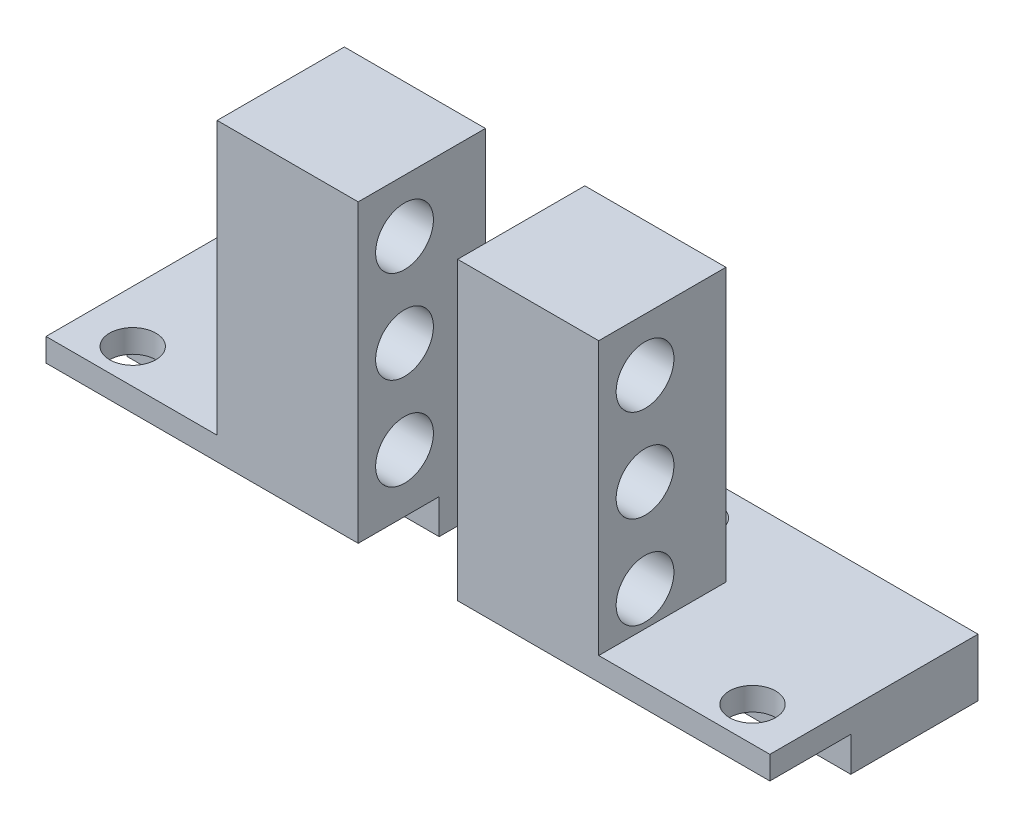
ISO-10303-21;
HEADER;
FILE_DESCRIPTION(('STEP AP214'),'2;1');
FILE_NAME('part.step','',(''),(''),'','','');
FILE_SCHEMA(('AUTOMOTIVE_DESIGN { 1 0 10303 214 1 1 1 1 }'));
ENDSEC;
DATA;
#1=APPLICATION_CONTEXT('core data for automotive mechanical design processes');
#2=APPLICATION_PROTOCOL_DEFINITION('international standard','automotive_design',2000,#1);
#3=PRODUCT_CONTEXT('',#1,'mechanical');
#4=PRODUCT('Part','Part','',(#3));
#5=PRODUCT_RELATED_PRODUCT_CATEGORY('part','',(#4));
#6=PRODUCT_DEFINITION_FORMATION('','',#4);
#7=PRODUCT_DEFINITION_CONTEXT('part definition',#1,'design');
#8=PRODUCT_DEFINITION('design','',#6,#7);
#9=PRODUCT_DEFINITION_SHAPE('','',#8);
#10=(LENGTH_UNIT() NAMED_UNIT(*) SI_UNIT(.MILLI.,.METRE.));
#11=(NAMED_UNIT(*) PLANE_ANGLE_UNIT() SI_UNIT($,.RADIAN.));
#12=(NAMED_UNIT(*) SI_UNIT($,.STERADIAN.) SOLID_ANGLE_UNIT());
#13=UNCERTAINTY_MEASURE_WITH_UNIT(LENGTH_MEASURE(1.E-05),#10,'distance_accuracy_value','');
#14=(GEOMETRIC_REPRESENTATION_CONTEXT(3) GLOBAL_UNCERTAINTY_ASSIGNED_CONTEXT((#13)) GLOBAL_UNIT_ASSIGNED_CONTEXT((#10,
#11,#12)) REPRESENTATION_CONTEXT('',''));
#15=CARTESIAN_POINT('',(0.,0.,0.));
#16=DIRECTION('',(0.,0.,1.));
#17=DIRECTION('',(1.,0.,0.));
#18=AXIS2_PLACEMENT_3D('',#15,#16,#17);
#19=CARTESIAN_POINT('',(0.,-23.578,-18.));
#20=DIRECTION('',(-1.,0.,0.));
#21=DIRECTION('',(0.,0.,1.));
#22=AXIS2_PLACEMENT_3D('',#19,#20,#21);
#23=PLANE('',#22);
#24=DIRECTION('',(0.,1.,0.));
#25=VECTOR('',#24,1.);
#26=CARTESIAN_POINT('',(0.,-23.578,-11.));
#27=LINE('',#26,#25);
#28=CARTESIAN_POINT('',(0.,-23.578,-11.));
#29=VERTEX_POINT('',#28);
#30=CARTESIAN_POINT('',(0.,0.,-11.));
#31=VERTEX_POINT('',#30);
#32=EDGE_CURVE('E186',#29,#31,#27,.T.);
#33=ORIENTED_EDGE('',*,*,#32,.F.);
#34=DIRECTION('',(0.,0.,1.));
#35=VECTOR('',#34,1.);
#36=CARTESIAN_POINT('',(0.,-23.578,-18.));
#37=LINE('',#36,#35);
#38=CARTESIAN_POINT('',(0.,-23.578,0.));
#39=VERTEX_POINT('',#38);
#40=EDGE_CURVE('E104',#29,#39,#37,.T.);
#41=ORIENTED_EDGE('',*,*,#40,.T.);
#42=DIRECTION('',(0.,-1.,0.));
#43=VECTOR('',#42,1.);
#44=CARTESIAN_POINT('',(0.,-23.578,0.));
#45=LINE('',#44,#43);
#46=CARTESIAN_POINT('',(0.,0.,0.));
#47=VERTEX_POINT('',#46);
#48=EDGE_CURVE('E101',#47,#39,#45,.T.);
#49=ORIENTED_EDGE('',*,*,#48,.F.);
#50=DIRECTION('',(0.,0.,1.));
#51=VECTOR('',#50,1.);
#52=CARTESIAN_POINT('',(0.,0.,-18.));
#53=LINE('',#52,#51);
#54=EDGE_CURVE('E11',#31,#47,#53,.T.);
#55=ORIENTED_EDGE('',*,*,#54,.F.);
#56=EDGE_LOOP('',(#33,#41,#49,#55));
#57=FACE_BOUND('',#56,.T.);
#58=CARTESIAN_POINT('',(0.,-4.57800000000001,-4.00493473861688));
#59=DIRECTION('',(-1.,0.,0.));
#60=DIRECTION('',(0.,0.,1.));
#61=AXIS2_PLACEMENT_3D('',#58,#59,#60);
#62=CIRCLE('',#61,2.5);
#63=CARTESIAN_POINT('',(0.,-4.57800000000001,-1.50493473861688));
#64=VERTEX_POINT('',#63);
#65=EDGE_CURVE('E110',#64,#64,#62,.T.);
#66=ORIENTED_EDGE('',*,*,#65,.F.);
#67=EDGE_LOOP('',(#66));
#68=FACE_BOUND('',#67,.T.);
#69=CARTESIAN_POINT('',(0.,-12.578,-4.00493473861688));
#70=DIRECTION('',(-1.,0.,0.));
#71=DIRECTION('',(0.,0.,1.));
#72=AXIS2_PLACEMENT_3D('',#69,#70,#71);
#73=CIRCLE('',#72,2.5);
#74=CARTESIAN_POINT('',(0.,-12.578,-1.50493473861688));
#75=VERTEX_POINT('',#74);
#76=EDGE_CURVE('E194',#75,#75,#73,.T.);
#77=ORIENTED_EDGE('',*,*,#76,.F.);
#78=EDGE_LOOP('',(#77));
#79=FACE_BOUND('',#78,.T.);
#80=CARTESIAN_POINT('',(0.,-20.578,-4.00493473861688));
#81=DIRECTION('',(-1.,0.,0.));
#82=DIRECTION('',(0.,0.,1.));
#83=AXIS2_PLACEMENT_3D('',#80,#81,#82);
#84=CIRCLE('',#83,2.5);
#85=CARTESIAN_POINT('',(0.,-20.578,-1.50493473861688));
#86=VERTEX_POINT('',#85);
#87=EDGE_CURVE('E190',#86,#86,#84,.T.);
#88=ORIENTED_EDGE('',*,*,#87,.F.);
#89=EDGE_LOOP('',(#88));
#90=FACE_BOUND('',#89,.T.);
#91=ADVANCED_FACE('F45',(#57,#68,#79,#90),#23,.T.);
#92=CARTESIAN_POINT('',(0.,0.,-18.));
#93=DIRECTION('',(0.,1.,0.));
#94=DIRECTION('',(0.,0.,1.));
#95=AXIS2_PLACEMENT_3D('',#92,#93,#94);
#96=PLANE('',#95);
#97=DIRECTION('',(-1.,0.,0.));
#98=VECTOR('',#97,1.);
#99=CARTESIAN_POINT('',(12.2,0.,-11.));
#100=LINE('',#99,#98);
#101=CARTESIAN_POINT('',(12.2,0.,-11.));
#102=VERTEX_POINT('',#101);
#103=EDGE_CURVE('E97',#102,#31,#100,.T.);
#104=ORIENTED_EDGE('',*,*,#103,.T.);
#105=ORIENTED_EDGE('',*,*,#54,.T.);
#106=DIRECTION('',(-1.,0.,0.));
#107=VECTOR('',#106,1.);
#108=CARTESIAN_POINT('',(0.,0.,0.));
#109=LINE('',#108,#107);
#110=CARTESIAN_POINT('',(12.2,0.,0.));
#111=VERTEX_POINT('',#110);
#112=EDGE_CURVE('E95',#111,#47,#109,.T.);
#113=ORIENTED_EDGE('',*,*,#112,.F.);
#114=DIRECTION('',(0.,0.,1.));
#115=VECTOR('',#114,1.);
#116=CARTESIAN_POINT('',(12.2,0.,-18.));
#117=LINE('',#116,#115);
#118=EDGE_CURVE('E54',#102,#111,#117,.T.);
#119=ORIENTED_EDGE('',*,*,#118,.F.);
#120=EDGE_LOOP('',(#104,#105,#113,#119));
#121=FACE_BOUND('',#120,.T.);
#122=ADVANCED_FACE('F92',(#121),#96,.T.);
#123=CARTESIAN_POINT('',(12.2,0.,-18.));
#124=DIRECTION('',(1.,0.,0.));
#125=DIRECTION('',(0.,1.,0.));
#126=AXIS2_PLACEMENT_3D('',#123,#124,#125);
#127=PLANE('',#126);
#128=DIRECTION('',(0.,-1.,0.));
#129=VECTOR('',#128,1.);
#130=CARTESIAN_POINT('',(12.2,-23.578,-11.));
#131=LINE('',#130,#129);
#132=CARTESIAN_POINT('',(12.2,-23.578,-11.));
#133=VERTEX_POINT('',#132);
#134=CARTESIAN_POINT('',(12.2,-28.578,-11.));
#135=VERTEX_POINT('',#134);
#136=EDGE_CURVE('E396',#133,#135,#131,.T.);
#137=ORIENTED_EDGE('',*,*,#136,.F.);
#138=DIRECTION('',(0.,1.,0.));
#139=VECTOR('',#138,1.);
#140=CARTESIAN_POINT('',(12.2,-23.578,-11.));
#141=LINE('',#140,#139);
#142=EDGE_CURVE('E182',#133,#102,#141,.T.);
#143=ORIENTED_EDGE('',*,*,#142,.T.);
#144=ORIENTED_EDGE('',*,*,#118,.T.);
#145=DIRECTION('',(0.,1.,0.));
#146=VECTOR('',#145,1.);
#147=CARTESIAN_POINT('',(12.2,0.,0.));
#148=LINE('',#147,#146);
#149=CARTESIAN_POINT('',(12.2,-25.578,0.));
#150=VERTEX_POINT('',#149);
#151=EDGE_CURVE('E116',#150,#111,#148,.T.);
#152=ORIENTED_EDGE('',*,*,#151,.F.);
#153=DIRECTION('',(0.,0.,-1.));
#154=VECTOR('',#153,1.);
#155=CARTESIAN_POINT('',(12.2,-25.578,0.));
#156=LINE('',#155,#154);
#157=CARTESIAN_POINT('',(12.2,-25.578,-7.));
#158=VERTEX_POINT('',#157);
#159=EDGE_CURVE('E62',#150,#158,#156,.T.);
#160=ORIENTED_EDGE('',*,*,#159,.T.);
#161=DIRECTION('',(0.,-1.,0.));
#162=VECTOR('',#161,1.);
#163=CARTESIAN_POINT('',(12.2,-28.578,-7.));
#164=LINE('',#163,#162);
#165=CARTESIAN_POINT('',(12.2,-28.578,-7.));
#166=VERTEX_POINT('',#165);
#167=EDGE_CURVE('E426',#158,#166,#164,.T.);
#168=ORIENTED_EDGE('',*,*,#167,.T.);
#169=DIRECTION('',(0.,0.,1.));
#170=VECTOR('',#169,1.);
#171=CARTESIAN_POINT('',(12.2,-28.578,-18.));
#172=LINE('',#171,#170);
#173=EDGE_CURVE('E131',#135,#166,#172,.T.);
#174=ORIENTED_EDGE('',*,*,#173,.F.);
#175=EDGE_LOOP('',(#137,#143,#144,#152,#160,#168,#174));
#176=FACE_BOUND('',#175,.T.);
#177=CARTESIAN_POINT('',(12.2,-4.57800000000001,-4.00493473861688));
#178=DIRECTION('',(-1.,0.,0.));
#179=DIRECTION('',(0.,0.,1.));
#180=AXIS2_PLACEMENT_3D('',#177,#178,#179);
#181=CIRCLE('',#180,2.5);
#182=CARTESIAN_POINT('',(12.2,-4.57800000000001,-1.50493473861688));
#183=VERTEX_POINT('',#182);
#184=EDGE_CURVE('E168',#183,#183,#181,.T.);
#185=ORIENTED_EDGE('',*,*,#184,.T.);
#186=EDGE_LOOP('',(#185));
#187=FACE_BOUND('',#186,.T.);
#188=CARTESIAN_POINT('',(12.2,-12.578,-4.00493473861688));
#189=DIRECTION('',(-1.,0.,0.));
#190=DIRECTION('',(0.,0.,1.));
#191=AXIS2_PLACEMENT_3D('',#188,#189,#190);
#192=CIRCLE('',#191,2.5);
#193=CARTESIAN_POINT('',(12.2,-12.578,-1.50493473861688));
#194=VERTEX_POINT('',#193);
#195=EDGE_CURVE('E173',#194,#194,#192,.T.);
#196=ORIENTED_EDGE('',*,*,#195,.T.);
#197=EDGE_LOOP('',(#196));
#198=FACE_BOUND('',#197,.T.);
#199=CARTESIAN_POINT('',(12.2,-20.578,-4.00493473861688));
#200=DIRECTION('',(-1.,0.,0.));
#201=DIRECTION('',(0.,0.,1.));
#202=AXIS2_PLACEMENT_3D('',#199,#200,#201);
#203=CIRCLE('',#202,2.5);
#204=CARTESIAN_POINT('',(12.2,-20.578,-1.50493473861688));
#205=VERTEX_POINT('',#204);
#206=EDGE_CURVE('E178',#205,#205,#203,.T.);
#207=ORIENTED_EDGE('',*,*,#206,.T.);
#208=EDGE_LOOP('',(#207));
#209=FACE_BOUND('',#208,.T.);
#210=ADVANCED_FACE('F218',(#176,#187,#198,#209),#127,.T.);
#211=CARTESIAN_POINT('',(12.2,-28.578,-18.));
#212=DIRECTION('',(0.,-1.,0.));
#213=DIRECTION('',(1.,0.,0.));
#214=AXIS2_PLACEMENT_3D('',#211,#212,#213);
#215=PLANE('',#214);
#216=CARTESIAN_POINT('',(6.1,-28.578,-14.5));
#217=DIRECTION('',(0.,1.,0.));
#218=DIRECTION('',(0.,0.,1.));
#219=AXIS2_PLACEMENT_3D('',#216,#217,#218);
#220=CIRCLE('',#219,2.);
#221=CARTESIAN_POINT('',(6.1,-28.578,-12.5));
#222=VERTEX_POINT('',#221);
#223=EDGE_CURVE('E400',#222,#222,#220,.T.);
#224=ORIENTED_EDGE('',*,*,#223,.T.);
#225=EDGE_LOOP('',(#224));
#226=FACE_BOUND('',#225,.T.);
#227=DIRECTION('',(-1.,0.,0.));
#228=VECTOR('',#227,1.);
#229=CARTESIAN_POINT('',(12.2,-28.578,-7.));
#230=LINE('',#229,#228);
#231=CARTESIAN_POINT('',(-14.8,-28.578,-7.));
#232=VERTEX_POINT('',#231);
#233=EDGE_CURVE('E431',#166,#232,#230,.T.);
#234=ORIENTED_EDGE('',*,*,#233,.T.);
#235=DIRECTION('',(0.,0.,1.));
#236=VECTOR('',#235,1.);
#237=CARTESIAN_POINT('',(-14.8,-28.578,-18.));
#238=LINE('',#237,#236);
#239=CARTESIAN_POINT('',(-14.8,-28.578,-18.));
#240=VERTEX_POINT('',#239);
#241=EDGE_CURVE('E71',#240,#232,#238,.T.);
#242=ORIENTED_EDGE('',*,*,#241,.F.);
#243=DIRECTION('',(1.,0.,0.));
#244=VECTOR('',#243,1.);
#245=CARTESIAN_POINT('',(12.2,-28.578,-18.));
#246=LINE('',#245,#244);
#247=CARTESIAN_POINT('',(47.8,-28.578,-18.));
#248=VERTEX_POINT('',#247);
#249=EDGE_CURVE('E140',#240,#248,#246,.T.);
#250=ORIENTED_EDGE('',*,*,#249,.T.);
#251=DIRECTION('',(0.,0.,1.));
#252=VECTOR('',#251,1.);
#253=CARTESIAN_POINT('',(47.8,-28.578,-18.));
#254=LINE('',#253,#252);
#255=CARTESIAN_POINT('',(47.8,-28.578,-7.));
#256=VERTEX_POINT('',#255);
#257=EDGE_CURVE('E379',#248,#256,#254,.T.);
#258=ORIENTED_EDGE('',*,*,#257,.T.);
#259=DIRECTION('',(1.,0.,0.));
#260=VECTOR('',#259,1.);
#261=CARTESIAN_POINT('',(20.8,-28.578,-7.));
#262=LINE('',#261,#260);
#263=CARTESIAN_POINT('',(20.8,-28.578,-7.));
#264=VERTEX_POINT('',#263);
#265=EDGE_CURVE('E303',#264,#256,#262,.T.);
#266=ORIENTED_EDGE('',*,*,#265,.F.);
#267=DIRECTION('',(0.,0.,1.));
#268=VECTOR('',#267,1.);
#269=CARTESIAN_POINT('',(20.8,-28.578,-18.));
#270=LINE('',#269,#268);
#271=CARTESIAN_POINT('',(20.8,-28.578,-11.));
#272=VERTEX_POINT('',#271);
#273=EDGE_CURVE('E375',#272,#264,#270,.T.);
#274=ORIENTED_EDGE('',*,*,#273,.F.);
#275=DIRECTION('',(-1.,0.,0.));
#276=VECTOR('',#275,1.);
#277=CARTESIAN_POINT('',(47.802,-28.578,-11.));
#278=LINE('',#277,#276);
#279=EDGE_CURVE('E395',#272,#135,#278,.T.);
#280=ORIENTED_EDGE('',*,*,#279,.T.);
#281=ORIENTED_EDGE('',*,*,#173,.T.);
#282=EDGE_LOOP('',(#234,#242,#250,#258,#266,#274,#280,#281));
#283=FACE_BOUND('',#282,.T.);
#284=CARTESIAN_POINT('',(26.9,-28.578,-14.5));
#285=DIRECTION('',(0.,-1.,0.));
#286=DIRECTION('',(0.,0.,1.));
#287=AXIS2_PLACEMENT_3D('',#284,#285,#286);
#288=CIRCLE('',#287,2.);
#289=CARTESIAN_POINT('',(26.9,-28.578,-12.5));
#290=VERTEX_POINT('',#289);
#291=EDGE_CURVE('E265',#290,#290,#288,.T.);
#292=ORIENTED_EDGE('',*,*,#291,.F.);
#293=EDGE_LOOP('',(#292));
#294=FACE_BOUND('',#293,.T.);
#295=ADVANCED_FACE('F220',(#226,#283,#294),#215,.T.);
#296=CARTESIAN_POINT('',(-14.8,-28.578,-18.));
#297=DIRECTION('',(-1.,0.,0.));
#298=DIRECTION('',(0.,0.,1.));
#299=AXIS2_PLACEMENT_3D('',#296,#297,#298);
#300=PLANE('',#299);
#301=DIRECTION('',(0.,-1.,0.));
#302=VECTOR('',#301,1.);
#303=CARTESIAN_POINT('',(-14.8,-28.578,-7.));
#304=LINE('',#303,#302);
#305=CARTESIAN_POINT('',(-14.8,-25.578,-7.));
#306=VERTEX_POINT('',#305);
#307=EDGE_CURVE('E166',#306,#232,#304,.T.);
#308=ORIENTED_EDGE('',*,*,#307,.F.);
#309=DIRECTION('',(0.,0.,-1.));
#310=VECTOR('',#309,1.);
#311=CARTESIAN_POINT('',(-14.8,-25.578,0.));
#312=LINE('',#311,#310);
#313=CARTESIAN_POINT('',(-14.8,-25.578,0.));
#314=VERTEX_POINT('',#313);
#315=EDGE_CURVE('E164',#314,#306,#312,.T.);
#316=ORIENTED_EDGE('',*,*,#315,.F.);
#317=DIRECTION('',(0.,-1.,0.));
#318=VECTOR('',#317,1.);
#319=CARTESIAN_POINT('',(-14.8,-28.578,0.));
#320=LINE('',#319,#318);
#321=CARTESIAN_POINT('',(-14.8,-23.578,0.));
#322=VERTEX_POINT('',#321);
#323=EDGE_CURVE('E125',#322,#314,#320,.T.);
#324=ORIENTED_EDGE('',*,*,#323,.F.);
#325=DIRECTION('',(0.,0.,1.));
#326=VECTOR('',#325,1.);
#327=CARTESIAN_POINT('',(-14.8,-23.578,-18.));
#328=LINE('',#327,#326);
#329=CARTESIAN_POINT('',(-14.8,-23.578,-18.));
#330=VERTEX_POINT('',#329);
#331=EDGE_CURVE('E137',#330,#322,#328,.T.);
#332=ORIENTED_EDGE('',*,*,#331,.F.);
#333=DIRECTION('',(0.,-1.,0.));
#334=VECTOR('',#333,1.);
#335=CARTESIAN_POINT('',(-14.8,-28.578,-18.));
#336=LINE('',#335,#334);
#337=EDGE_CURVE('E123',#330,#240,#336,.T.);
#338=ORIENTED_EDGE('',*,*,#337,.T.);
#339=ORIENTED_EDGE('',*,*,#241,.T.);
#340=EDGE_LOOP('',(#308,#316,#324,#332,#338,#339));
#341=FACE_BOUND('',#340,.T.);
#342=ADVANCED_FACE('F161',(#341),#300,.T.);
#343=CARTESIAN_POINT('',(-14.8,-23.578,-18.));
#344=DIRECTION('',(0.,1.,0.));
#345=DIRECTION('',(0.,0.,1.));
#346=AXIS2_PLACEMENT_3D('',#343,#344,#345);
#347=PLANE('',#346);
#348=CARTESIAN_POINT('',(-10.3,-23.578,-3.));
#349=DIRECTION('',(0.,1.,0.));
#350=DIRECTION('',(0.,0.,1.));
#351=AXIS2_PLACEMENT_3D('',#348,#349,#350);
#352=CIRCLE('',#351,2.);
#353=CARTESIAN_POINT('',(-10.3,-23.578,-1.));
#354=VERTEX_POINT('',#353);
#355=EDGE_CURVE('E248',#354,#354,#352,.T.);
#356=ORIENTED_EDGE('',*,*,#355,.F.);
#357=EDGE_LOOP('',(#356));
#358=FACE_BOUND('',#357,.T.);
#359=CARTESIAN_POINT('',(6.1,-23.578,-14.5));
#360=DIRECTION('',(0.,1.,0.));
#361=DIRECTION('',(0.,0.,1.));
#362=AXIS2_PLACEMENT_3D('',#359,#360,#361);
#363=CIRCLE('',#362,2.);
#364=CARTESIAN_POINT('',(6.1,-23.578,-12.5));
#365=VERTEX_POINT('',#364);
#366=EDGE_CURVE('E252',#365,#365,#363,.T.);
#367=ORIENTED_EDGE('',*,*,#366,.F.);
#368=EDGE_LOOP('',(#367));
#369=FACE_BOUND('',#368,.T.);
#370=ORIENTED_EDGE('',*,*,#40,.F.);
#371=DIRECTION('',(-1.,0.,0.));
#372=VECTOR('',#371,1.);
#373=CARTESIAN_POINT('',(12.2,-23.578,-11.));
#374=LINE('',#373,#372);
#375=EDGE_CURVE('E418',#133,#29,#374,.T.);
#376=ORIENTED_EDGE('',*,*,#375,.F.);
#377=DIRECTION('',(-1.,0.,0.));
#378=VECTOR('',#377,1.);
#379=CARTESIAN_POINT('',(47.802,-23.578,-11.));
#380=LINE('',#379,#378);
#381=CARTESIAN_POINT('',(20.8,-23.578,-11.));
#382=VERTEX_POINT('',#381);
#383=EDGE_CURVE('E401',#382,#133,#380,.T.);
#384=ORIENTED_EDGE('',*,*,#383,.F.);
#385=DIRECTION('',(1.,0.,0.));
#386=VECTOR('',#385,1.);
#387=CARTESIAN_POINT('',(20.8,-23.578,-11.));
#388=LINE('',#387,#386);
#389=CARTESIAN_POINT('',(33.,-23.578,-11.));
#390=VERTEX_POINT('',#389);
#391=EDGE_CURVE('E278',#382,#390,#388,.T.);
#392=ORIENTED_EDGE('',*,*,#391,.T.);
#393=DIRECTION('',(0.,0.,1.));
#394=VECTOR('',#393,1.);
#395=CARTESIAN_POINT('',(33.,-23.578,-18.));
#396=LINE('',#395,#394);
#397=CARTESIAN_POINT('',(33.,-23.578,0.));
#398=VERTEX_POINT('',#397);
#399=EDGE_CURVE('E346',#390,#398,#396,.T.);
#400=ORIENTED_EDGE('',*,*,#399,.T.);
#401=DIRECTION('',(1.,0.,0.));
#402=VECTOR('',#401,1.);
#403=CARTESIAN_POINT('',(47.8,-23.578,0.));
#404=LINE('',#403,#402);
#405=CARTESIAN_POINT('',(47.8,-23.578,0.));
#406=VERTEX_POINT('',#405);
#407=EDGE_CURVE('E351',#398,#406,#404,.T.);
#408=ORIENTED_EDGE('',*,*,#407,.T.);
#409=DIRECTION('',(0.,0.,1.));
#410=VECTOR('',#409,1.);
#411=CARTESIAN_POINT('',(47.8,-23.578,-18.));
#412=LINE('',#411,#410);
#413=CARTESIAN_POINT('',(47.8,-23.578,-18.));
#414=VERTEX_POINT('',#413);
#415=EDGE_CURVE('E382',#414,#406,#412,.T.);
#416=ORIENTED_EDGE('',*,*,#415,.F.);
#417=DIRECTION('',(-1.,0.,0.));
#418=VECTOR('',#417,1.);
#419=CARTESIAN_POINT('',(-14.8,-23.578,-18.));
#420=LINE('',#419,#418);
#421=EDGE_CURVE('E118',#414,#330,#420,.T.);
#422=ORIENTED_EDGE('',*,*,#421,.T.);
#423=ORIENTED_EDGE('',*,*,#331,.T.);
#424=DIRECTION('',(-1.,0.,0.));
#425=VECTOR('',#424,1.);
#426=CARTESIAN_POINT('',(-14.8,-23.578,0.));
#427=LINE('',#426,#425);
#428=EDGE_CURVE('E109',#39,#322,#427,.T.);
#429=ORIENTED_EDGE('',*,*,#428,.F.);
#430=EDGE_LOOP('',(#370,#376,#384,#392,#400,#408,#416,#422,#423,#429));
#431=FACE_BOUND('',#430,.T.);
#432=CARTESIAN_POINT('',(43.3,-23.578,-3.));
#433=DIRECTION('',(0.,-1.,0.));
#434=DIRECTION('',(0.,0.,1.));
#435=AXIS2_PLACEMENT_3D('',#432,#433,#434);
#436=CIRCLE('',#435,2.);
#437=CARTESIAN_POINT('',(43.3,-23.578,-1.));
#438=VERTEX_POINT('',#437);
#439=EDGE_CURVE('E259',#438,#438,#436,.T.);
#440=ORIENTED_EDGE('',*,*,#439,.T.);
#441=EDGE_LOOP('',(#440));
#442=FACE_BOUND('',#441,.T.);
#443=CARTESIAN_POINT('',(26.9,-23.578,-14.5));
#444=DIRECTION('',(0.,-1.,0.));
#445=DIRECTION('',(0.,0.,1.));
#446=AXIS2_PLACEMENT_3D('',#443,#444,#445);
#447=CIRCLE('',#446,2.);
#448=CARTESIAN_POINT('',(26.9,-23.578,-12.5));
#449=VERTEX_POINT('',#448);
#450=EDGE_CURVE('E262',#449,#449,#447,.T.);
#451=ORIENTED_EDGE('',*,*,#450,.T.);
#452=EDGE_LOOP('',(#451));
#453=FACE_BOUND('',#452,.T.);
#454=ADVANCED_FACE('F236',(#358,#369,#431,#442,#453),#347,.T.);
#455=CARTESIAN_POINT('',(0.,0.,-18.));
#456=DIRECTION('',(0.,0.,-1.));
#457=DIRECTION('',(-1.,0.,0.));
#458=AXIS2_PLACEMENT_3D('',#455,#456,#457);
#459=PLANE('',#458);
#460=ORIENTED_EDGE('',*,*,#421,.F.);
#461=DIRECTION('',(0.,-1.,0.));
#462=VECTOR('',#461,1.);
#463=CARTESIAN_POINT('',(47.8,-28.578,-18.));
#464=LINE('',#463,#462);
#465=EDGE_CURVE('E343',#414,#248,#464,.T.);
#466=ORIENTED_EDGE('',*,*,#465,.T.);
#467=ORIENTED_EDGE('',*,*,#249,.F.);
#468=ORIENTED_EDGE('',*,*,#337,.F.);
#469=EDGE_LOOP('',(#460,#466,#467,#468));
#470=FACE_BOUND('',#469,.T.);
#471=ADVANCED_FACE('F238',(#470),#459,.T.);
#472=CARTESIAN_POINT('',(0.,0.,0.));
#473=DIRECTION('',(0.,0.,-1.));
#474=DIRECTION('',(-1.,0.,0.));
#475=AXIS2_PLACEMENT_3D('',#472,#473,#474);
#476=PLANE('',#475);
#477=ORIENTED_EDGE('',*,*,#323,.T.);
#478=DIRECTION('',(-1.,0.,0.));
#479=VECTOR('',#478,1.);
#480=CARTESIAN_POINT('',(12.2,-25.578,0.));
#481=LINE('',#480,#479);
#482=EDGE_CURVE('E154',#150,#314,#481,.T.);
#483=ORIENTED_EDGE('',*,*,#482,.F.);
#484=ORIENTED_EDGE('',*,*,#151,.T.);
#485=ORIENTED_EDGE('',*,*,#112,.T.);
#486=ORIENTED_EDGE('',*,*,#48,.T.);
#487=ORIENTED_EDGE('',*,*,#428,.T.);
#488=EDGE_LOOP('',(#477,#483,#484,#485,#486,#487));
#489=FACE_BOUND('',#488,.T.);
#490=ADVANCED_FACE('F114',(#489),#476,.F.);
#491=CARTESIAN_POINT('',(12.2,-28.578,-7.));
#492=DIRECTION('',(0.,0.,-1.));
#493=DIRECTION('',(-1.,0.,0.));
#494=AXIS2_PLACEMENT_3D('',#491,#492,#493);
#495=PLANE('',#494);
#496=ORIENTED_EDGE('',*,*,#233,.F.);
#497=ORIENTED_EDGE('',*,*,#167,.F.);
#498=DIRECTION('',(-1.,0.,0.));
#499=VECTOR('',#498,1.);
#500=CARTESIAN_POINT('',(12.2,-25.578,-7.));
#501=LINE('',#500,#499);
#502=EDGE_CURVE('E427',#158,#306,#501,.T.);
#503=ORIENTED_EDGE('',*,*,#502,.T.);
#504=ORIENTED_EDGE('',*,*,#307,.T.);
#505=EDGE_LOOP('',(#496,#497,#503,#504));
#506=FACE_BOUND('',#505,.T.);
#507=ADVANCED_FACE('F556',(#506),#495,.F.);
#508=CARTESIAN_POINT('',(12.2,-25.578,0.));
#509=DIRECTION('',(0.,1.,0.));
#510=DIRECTION('',(0.,0.,1.));
#511=AXIS2_PLACEMENT_3D('',#508,#509,#510);
#512=PLANE('',#511);
#513=CARTESIAN_POINT('',(-10.3,-25.578,-3.));
#514=DIRECTION('',(0.,1.,0.));
#515=DIRECTION('',(0.,0.,1.));
#516=AXIS2_PLACEMENT_3D('',#513,#514,#515);
#517=CIRCLE('',#516,2.);
#518=CARTESIAN_POINT('',(-10.3,-25.578,-1.));
#519=VERTEX_POINT('',#518);
#520=EDGE_CURVE('E48',#519,#519,#517,.T.);
#521=ORIENTED_EDGE('',*,*,#520,.T.);
#522=EDGE_LOOP('',(#521));
#523=FACE_BOUND('',#522,.T.);
#524=ORIENTED_EDGE('',*,*,#502,.F.);
#525=ORIENTED_EDGE('',*,*,#159,.F.);
#526=ORIENTED_EDGE('',*,*,#482,.T.);
#527=ORIENTED_EDGE('',*,*,#315,.T.);
#528=EDGE_LOOP('',(#524,#525,#526,#527));
#529=FACE_BOUND('',#528,.T.);
#530=ADVANCED_FACE('F551',(#523,#529),#512,.F.);
#531=CARTESIAN_POINT('',(12.2,-23.578,-11.));
#532=DIRECTION('',(0.,0.,1.));
#533=DIRECTION('',(1.,0.,0.));
#534=AXIS2_PLACEMENT_3D('',#531,#532,#533);
#535=PLANE('',#534);
#536=ORIENTED_EDGE('',*,*,#32,.T.);
#537=ORIENTED_EDGE('',*,*,#103,.F.);
#538=ORIENTED_EDGE('',*,*,#142,.F.);
#539=ORIENTED_EDGE('',*,*,#375,.T.);
#540=EDGE_LOOP('',(#536,#537,#538,#539));
#541=FACE_BOUND('',#540,.T.);
#542=ADVANCED_FACE('F214',(#541),#535,.F.);
#543=CARTESIAN_POINT('',(12.2,-20.578,-4.00493473861688));
#544=DIRECTION('',(-1.,0.,0.));
#545=DIRECTION('',(0.,0.,1.));
#546=AXIS2_PLACEMENT_3D('',#543,#544,#545);
#547=CYLINDRICAL_SURFACE('',#546,2.5);
#548=ORIENTED_EDGE('',*,*,#87,.T.);
#549=EDGE_LOOP('',(#548));
#550=FACE_BOUND('',#549,.T.);
#551=ORIENTED_EDGE('',*,*,#206,.F.);
#552=EDGE_LOOP('',(#551));
#553=FACE_BOUND('',#552,.T.);
#554=ADVANCED_FACE('F210',(#550,#553),#547,.F.);
#555=CARTESIAN_POINT('',(12.2,-12.578,-4.00493473861688));
#556=DIRECTION('',(-1.,0.,0.));
#557=DIRECTION('',(0.,0.,1.));
#558=AXIS2_PLACEMENT_3D('',#555,#556,#557);
#559=CYLINDRICAL_SURFACE('',#558,2.5);
#560=ORIENTED_EDGE('',*,*,#76,.T.);
#561=EDGE_LOOP('',(#560));
#562=FACE_BOUND('',#561,.T.);
#563=ORIENTED_EDGE('',*,*,#195,.F.);
#564=EDGE_LOOP('',(#563));
#565=FACE_BOUND('',#564,.T.);
#566=ADVANCED_FACE('F213',(#562,#565),#559,.F.);
#567=CARTESIAN_POINT('',(12.2,-4.57800000000001,-4.00493473861688));
#568=DIRECTION('',(-1.,0.,0.));
#569=DIRECTION('',(0.,0.,1.));
#570=AXIS2_PLACEMENT_3D('',#567,#568,#569);
#571=CYLINDRICAL_SURFACE('',#570,2.5);
#572=ORIENTED_EDGE('',*,*,#65,.T.);
#573=EDGE_LOOP('',(#572));
#574=FACE_BOUND('',#573,.T.);
#575=ORIENTED_EDGE('',*,*,#184,.F.);
#576=EDGE_LOOP('',(#575));
#577=FACE_BOUND('',#576,.T.);
#578=ADVANCED_FACE('F202',(#574,#577),#571,.F.);
#579=CARTESIAN_POINT('',(-10.3,-28.578,-3.));
#580=DIRECTION('',(0.,1.,0.));
#581=DIRECTION('',(0.,0.,1.));
#582=AXIS2_PLACEMENT_3D('',#579,#580,#581);
#583=CYLINDRICAL_SURFACE('',#582,2.);
#584=ORIENTED_EDGE('',*,*,#355,.T.);
#585=EDGE_LOOP('',(#584));
#586=FACE_BOUND('',#585,.T.);
#587=ORIENTED_EDGE('',*,*,#520,.F.);
#588=EDGE_LOOP('',(#587));
#589=FACE_BOUND('',#588,.T.);
#590=ADVANCED_FACE('F541',(#586,#589),#583,.F.);
#591=CARTESIAN_POINT('',(6.1,-28.578,-14.5));
#592=DIRECTION('',(0.,1.,0.));
#593=DIRECTION('',(0.,0.,1.));
#594=AXIS2_PLACEMENT_3D('',#591,#592,#593);
#595=CYLINDRICAL_SURFACE('',#594,2.);
#596=ORIENTED_EDGE('',*,*,#223,.F.);
#597=EDGE_LOOP('',(#596));
#598=FACE_BOUND('',#597,.T.);
#599=ORIENTED_EDGE('',*,*,#366,.T.);
#600=EDGE_LOOP('',(#599));
#601=FACE_BOUND('',#600,.T.);
#602=ADVANCED_FACE('F533',(#598,#601),#595,.F.);
#603=CARTESIAN_POINT('',(47.802,-23.578,-11.));
#604=DIRECTION('',(0.,0.,-1.));
#605=DIRECTION('',(-1.,0.,0.));
#606=AXIS2_PLACEMENT_3D('',#603,#604,#605);
#607=PLANE('',#606);
#608=ORIENTED_EDGE('',*,*,#279,.F.);
#609=DIRECTION('',(0.,1.,0.));
#610=VECTOR('',#609,1.);
#611=CARTESIAN_POINT('',(20.8,-23.578,-11.));
#612=LINE('',#611,#610);
#613=EDGE_CURVE('E370',#272,#382,#612,.T.);
#614=ORIENTED_EDGE('',*,*,#613,.T.);
#615=ORIENTED_EDGE('',*,*,#383,.T.);
#616=ORIENTED_EDGE('',*,*,#136,.T.);
#617=EDGE_LOOP('',(#608,#614,#615,#616));
#618=FACE_BOUND('',#617,.T.);
#619=ADVANCED_FACE('F531',(#618),#607,.F.);
#620=CARTESIAN_POINT('',(20.8,0.,-18.));
#621=DIRECTION('',(-1.,0.,0.));
#622=DIRECTION('',(0.,1.,0.));
#623=AXIS2_PLACEMENT_3D('',#620,#621,#622);
#624=PLANE('',#623);
#625=CARTESIAN_POINT('',(20.8,-20.578,-4.00493473861688));
#626=DIRECTION('',(-1.,0.,0.));
#627=DIRECTION('',(0.,0.,1.));
#628=AXIS2_PLACEMENT_3D('',#625,#626,#627);
#629=CIRCLE('',#628,2.5);
#630=CARTESIAN_POINT('',(20.8,-20.578,-1.50493473861688));
#631=VERTEX_POINT('',#630);
#632=EDGE_CURVE('E279',#631,#631,#629,.T.);
#633=ORIENTED_EDGE('',*,*,#632,.F.);
#634=EDGE_LOOP('',(#633));
#635=FACE_BOUND('',#634,.T.);
#636=CARTESIAN_POINT('',(20.8,-12.578,-4.00493473861688));
#637=DIRECTION('',(-1.,0.,0.));
#638=DIRECTION('',(0.,0.,1.));
#639=AXIS2_PLACEMENT_3D('',#636,#637,#638);
#640=CIRCLE('',#639,2.5);
#641=CARTESIAN_POINT('',(20.8,-12.578,-1.50493473861688));
#642=VERTEX_POINT('',#641);
#643=EDGE_CURVE('E292',#642,#642,#640,.T.);
#644=ORIENTED_EDGE('',*,*,#643,.F.);
#645=EDGE_LOOP('',(#644));
#646=FACE_BOUND('',#645,.T.);
#647=CARTESIAN_POINT('',(20.8,-4.578,-4.00493473861688));
#648=DIRECTION('',(-1.,0.,0.));
#649=DIRECTION('',(0.,0.,1.));
#650=AXIS2_PLACEMENT_3D('',#647,#648,#649);
#651=CIRCLE('',#650,2.5);
#652=CARTESIAN_POINT('',(20.8,-4.578,-1.50493473861688));
#653=VERTEX_POINT('',#652);
#654=EDGE_CURVE('E288',#653,#653,#651,.T.);
#655=ORIENTED_EDGE('',*,*,#654,.F.);
#656=EDGE_LOOP('',(#655));
#657=FACE_BOUND('',#656,.T.);
#658=ORIENTED_EDGE('',*,*,#613,.F.);
#659=ORIENTED_EDGE('',*,*,#273,.T.);
#660=DIRECTION('',(0.,-1.,0.));
#661=VECTOR('',#660,1.);
#662=CARTESIAN_POINT('',(20.8,-28.578,-7.));
#663=LINE('',#662,#661);
#664=CARTESIAN_POINT('',(20.8,-25.578,-7.));
#665=VERTEX_POINT('',#664);
#666=EDGE_CURVE('E298',#665,#264,#663,.T.);
#667=ORIENTED_EDGE('',*,*,#666,.F.);
#668=DIRECTION('',(0.,0.,-1.));
#669=VECTOR('',#668,1.);
#670=CARTESIAN_POINT('',(20.8,-25.578,0.));
#671=LINE('',#670,#669);
#672=CARTESIAN_POINT('',(20.8,-25.578,0.));
#673=VERTEX_POINT('',#672);
#674=EDGE_CURVE('E310',#673,#665,#671,.T.);
#675=ORIENTED_EDGE('',*,*,#674,.F.);
#676=DIRECTION('',(0.,1.,0.));
#677=VECTOR('',#676,1.);
#678=CARTESIAN_POINT('',(20.8,0.,0.));
#679=LINE('',#678,#677);
#680=CARTESIAN_POINT('',(20.8,0.,0.));
#681=VERTEX_POINT('',#680);
#682=EDGE_CURVE('E359',#673,#681,#679,.T.);
#683=ORIENTED_EDGE('',*,*,#682,.T.);
#684=DIRECTION('',(0.,0.,1.));
#685=VECTOR('',#684,1.);
#686=CARTESIAN_POINT('',(20.8,0.,-18.));
#687=LINE('',#686,#685);
#688=CARTESIAN_POINT('',(20.8,0.,-11.));
#689=VERTEX_POINT('',#688);
#690=EDGE_CURVE('E371',#689,#681,#687,.T.);
#691=ORIENTED_EDGE('',*,*,#690,.F.);
#692=DIRECTION('',(0.,1.,0.));
#693=VECTOR('',#692,1.);
#694=CARTESIAN_POINT('',(20.8,-23.578,-11.));
#695=LINE('',#694,#693);
#696=EDGE_CURVE('E274',#382,#689,#695,.T.);
#697=ORIENTED_EDGE('',*,*,#696,.F.);
#698=EDGE_LOOP('',(#658,#659,#667,#675,#683,#691,#697));
#699=FACE_BOUND('',#698,.T.);
#700=ADVANCED_FACE('F502',(#635,#646,#657,#699),#624,.T.);
#701=CARTESIAN_POINT('',(33.,-23.578,-18.));
#702=DIRECTION('',(1.,0.,0.));
#703=DIRECTION('',(0.,0.,1.));
#704=AXIS2_PLACEMENT_3D('',#701,#702,#703);
#705=PLANE('',#704);
#706=DIRECTION('',(0.,1.,0.));
#707=VECTOR('',#706,1.);
#708=CARTESIAN_POINT('',(33.,-23.578,-11.));
#709=LINE('',#708,#707);
#710=CARTESIAN_POINT('',(33.,0.,-11.));
#711=VERTEX_POINT('',#710);
#712=EDGE_CURVE('E284',#390,#711,#709,.T.);
#713=ORIENTED_EDGE('',*,*,#712,.T.);
#714=DIRECTION('',(0.,0.,1.));
#715=VECTOR('',#714,1.);
#716=CARTESIAN_POINT('',(33.,0.,-18.));
#717=LINE('',#716,#715);
#718=CARTESIAN_POINT('',(33.,0.,0.));
#719=VERTEX_POINT('',#718);
#720=EDGE_CURVE('E366',#711,#719,#717,.T.);
#721=ORIENTED_EDGE('',*,*,#720,.T.);
#722=DIRECTION('',(0.,-1.,0.));
#723=VECTOR('',#722,1.);
#724=CARTESIAN_POINT('',(33.,-23.578,0.));
#725=LINE('',#724,#723);
#726=EDGE_CURVE('E342',#719,#398,#725,.T.);
#727=ORIENTED_EDGE('',*,*,#726,.T.);
#728=ORIENTED_EDGE('',*,*,#399,.F.);
#729=EDGE_LOOP('',(#713,#721,#727,#728));
#730=FACE_BOUND('',#729,.T.);
#731=CARTESIAN_POINT('',(33.,-4.578,-4.00493473861688));
#732=DIRECTION('',(-1.,0.,0.));
#733=DIRECTION('',(0.,0.,1.));
#734=AXIS2_PLACEMENT_3D('',#731,#732,#733);
#735=CIRCLE('',#734,2.5);
#736=CARTESIAN_POINT('',(33.,-4.578,-1.50493473861688));
#737=VERTEX_POINT('',#736);
#738=EDGE_CURVE('E338',#737,#737,#735,.T.);
#739=ORIENTED_EDGE('',*,*,#738,.T.);
#740=EDGE_LOOP('',(#739));
#741=FACE_BOUND('',#740,.T.);
#742=CARTESIAN_POINT('',(33.,-12.578,-4.00493473861688));
#743=DIRECTION('',(-1.,0.,0.));
#744=DIRECTION('',(0.,0.,1.));
#745=AXIS2_PLACEMENT_3D('',#742,#743,#744);
#746=CIRCLE('',#745,2.5);
#747=CARTESIAN_POINT('',(33.,-12.578,-1.50493473861688));
#748=VERTEX_POINT('',#747);
#749=EDGE_CURVE('E334',#748,#748,#746,.T.);
#750=ORIENTED_EDGE('',*,*,#749,.T.);
#751=EDGE_LOOP('',(#750));
#752=FACE_BOUND('',#751,.T.);
#753=CARTESIAN_POINT('',(33.,-20.578,-4.00493473861688));
#754=DIRECTION('',(-1.,0.,0.));
#755=DIRECTION('',(0.,0.,1.));
#756=AXIS2_PLACEMENT_3D('',#753,#754,#755);
#757=CIRCLE('',#756,2.5);
#758=CARTESIAN_POINT('',(33.,-20.578,-1.50493473861688));
#759=VERTEX_POINT('',#758);
#760=EDGE_CURVE('E330',#759,#759,#757,.T.);
#761=ORIENTED_EDGE('',*,*,#760,.T.);
#762=EDGE_LOOP('',(#761));
#763=FACE_BOUND('',#762,.T.);
#764=ADVANCED_FACE('F511',(#730,#741,#752,#763),#705,.T.);
#765=CARTESIAN_POINT('',(33.,0.,-18.));
#766=DIRECTION('',(0.,1.,0.));
#767=DIRECTION('',(0.,0.,1.));
#768=AXIS2_PLACEMENT_3D('',#765,#766,#767);
#769=PLANE('',#768);
#770=DIRECTION('',(1.,0.,0.));
#771=VECTOR('',#770,1.);
#772=CARTESIAN_POINT('',(20.8,0.,-11.));
#773=LINE('',#772,#771);
#774=EDGE_CURVE('E280',#689,#711,#773,.T.);
#775=ORIENTED_EDGE('',*,*,#774,.F.);
#776=ORIENTED_EDGE('',*,*,#690,.T.);
#777=DIRECTION('',(1.,0.,0.));
#778=VECTOR('',#777,1.);
#779=CARTESIAN_POINT('',(33.,0.,0.));
#780=LINE('',#779,#778);
#781=EDGE_CURVE('E347',#681,#719,#780,.T.);
#782=ORIENTED_EDGE('',*,*,#781,.T.);
#783=ORIENTED_EDGE('',*,*,#720,.F.);
#784=EDGE_LOOP('',(#775,#776,#782,#783));
#785=FACE_BOUND('',#784,.T.);
#786=ADVANCED_FACE('F507',(#785),#769,.T.);
#787=CARTESIAN_POINT('',(47.8,-28.578,-18.));
#788=DIRECTION('',(1.,0.,0.));
#789=DIRECTION('',(0.,0.,1.));
#790=AXIS2_PLACEMENT_3D('',#787,#788,#789);
#791=PLANE('',#790);
#792=DIRECTION('',(0.,-1.,0.));
#793=VECTOR('',#792,1.);
#794=CARTESIAN_POINT('',(47.8,-28.578,-7.));
#795=LINE('',#794,#793);
#796=CARTESIAN_POINT('',(47.8,-25.578,-7.));
#797=VERTEX_POINT('',#796);
#798=EDGE_CURVE('E314',#797,#256,#795,.T.);
#799=ORIENTED_EDGE('',*,*,#798,.T.);
#800=ORIENTED_EDGE('',*,*,#257,.F.);
#801=ORIENTED_EDGE('',*,*,#465,.F.);
#802=ORIENTED_EDGE('',*,*,#415,.T.);
#803=DIRECTION('',(0.,-1.,0.));
#804=VECTOR('',#803,1.);
#805=CARTESIAN_POINT('',(47.8,-28.578,0.));
#806=LINE('',#805,#804);
#807=CARTESIAN_POINT('',(47.8,-25.578,0.));
#808=VERTEX_POINT('',#807);
#809=EDGE_CURVE('E355',#406,#808,#806,.T.);
#810=ORIENTED_EDGE('',*,*,#809,.T.);
#811=DIRECTION('',(0.,0.,-1.));
#812=VECTOR('',#811,1.);
#813=CARTESIAN_POINT('',(47.8,-25.578,0.));
#814=LINE('',#813,#812);
#815=EDGE_CURVE('E293',#808,#797,#814,.T.);
#816=ORIENTED_EDGE('',*,*,#815,.T.);
#817=EDGE_LOOP('',(#799,#800,#801,#802,#810,#816));
#818=FACE_BOUND('',#817,.T.);
#819=ADVANCED_FACE('F520',(#818),#791,.T.);
#820=CARTESIAN_POINT('',(33.,0.,0.));
#821=DIRECTION('',(0.,0.,-1.));
#822=DIRECTION('',(1.,0.,0.));
#823=AXIS2_PLACEMENT_3D('',#820,#821,#822);
#824=PLANE('',#823);
#825=ORIENTED_EDGE('',*,*,#809,.F.);
#826=ORIENTED_EDGE('',*,*,#407,.F.);
#827=ORIENTED_EDGE('',*,*,#726,.F.);
#828=ORIENTED_EDGE('',*,*,#781,.F.);
#829=ORIENTED_EDGE('',*,*,#682,.F.);
#830=DIRECTION('',(1.,0.,0.));
#831=VECTOR('',#830,1.);
#832=CARTESIAN_POINT('',(20.8,-25.578,0.));
#833=LINE('',#832,#831);
#834=EDGE_CURVE('E294',#673,#808,#833,.T.);
#835=ORIENTED_EDGE('',*,*,#834,.T.);
#836=EDGE_LOOP('',(#825,#826,#827,#828,#829,#835));
#837=FACE_BOUND('',#836,.T.);
#838=ADVANCED_FACE('F517',(#837),#824,.F.);
#839=CARTESIAN_POINT('',(20.8,-28.578,-7.));
#840=DIRECTION('',(0.,0.,-1.));
#841=DIRECTION('',(1.,0.,0.));
#842=AXIS2_PLACEMENT_3D('',#839,#840,#841);
#843=PLANE('',#842);
#844=ORIENTED_EDGE('',*,*,#265,.T.);
#845=ORIENTED_EDGE('',*,*,#798,.F.);
#846=DIRECTION('',(1.,0.,0.));
#847=VECTOR('',#846,1.);
#848=CARTESIAN_POINT('',(20.8,-25.578,-7.));
#849=LINE('',#848,#847);
#850=EDGE_CURVE('E299',#665,#797,#849,.T.);
#851=ORIENTED_EDGE('',*,*,#850,.F.);
#852=ORIENTED_EDGE('',*,*,#666,.T.);
#853=EDGE_LOOP('',(#844,#845,#851,#852));
#854=FACE_BOUND('',#853,.T.);
#855=ADVANCED_FACE('F527',(#854),#843,.F.);
#856=CARTESIAN_POINT('',(20.8,-25.578,0.));
#857=DIRECTION('',(0.,1.,0.));
#858=DIRECTION('',(0.,0.,1.));
#859=AXIS2_PLACEMENT_3D('',#856,#857,#858);
#860=PLANE('',#859);
#861=CARTESIAN_POINT('',(43.3,-25.578,-3.));
#862=DIRECTION('',(0.,-1.,0.));
#863=DIRECTION('',(0.,0.,1.));
#864=AXIS2_PLACEMENT_3D('',#861,#862,#863);
#865=CIRCLE('',#864,2.);
#866=CARTESIAN_POINT('',(43.3,-25.578,-1.));
#867=VERTEX_POINT('',#866);
#868=EDGE_CURVE('E269',#867,#867,#865,.T.);
#869=ORIENTED_EDGE('',*,*,#868,.F.);
#870=EDGE_LOOP('',(#869));
#871=FACE_BOUND('',#870,.T.);
#872=ORIENTED_EDGE('',*,*,#850,.T.);
#873=ORIENTED_EDGE('',*,*,#815,.F.);
#874=ORIENTED_EDGE('',*,*,#834,.F.);
#875=ORIENTED_EDGE('',*,*,#674,.T.);
#876=EDGE_LOOP('',(#872,#873,#874,#875));
#877=FACE_BOUND('',#876,.T.);
#878=ADVANCED_FACE('F648',(#871,#877),#860,.F.);
#879=CARTESIAN_POINT('',(20.8,-23.578,-11.));
#880=DIRECTION('',(0.,0.,1.));
#881=DIRECTION('',(-1.,0.,0.));
#882=AXIS2_PLACEMENT_3D('',#879,#880,#881);
#883=PLANE('',#882);
#884=ORIENTED_EDGE('',*,*,#712,.F.);
#885=ORIENTED_EDGE('',*,*,#391,.F.);
#886=ORIENTED_EDGE('',*,*,#696,.T.);
#887=ORIENTED_EDGE('',*,*,#774,.T.);
#888=EDGE_LOOP('',(#884,#885,#886,#887));
#889=FACE_BOUND('',#888,.T.);
#890=ADVANCED_FACE('F498',(#889),#883,.F.);
#891=CARTESIAN_POINT('',(20.8,-20.578,-4.00493473861688));
#892=DIRECTION('',(1.,0.,0.));
#893=DIRECTION('',(0.,0.,1.));
#894=AXIS2_PLACEMENT_3D('',#891,#892,#893);
#895=CYLINDRICAL_SURFACE('',#894,2.5);
#896=ORIENTED_EDGE('',*,*,#760,.F.);
#897=EDGE_LOOP('',(#896));
#898=FACE_BOUND('',#897,.T.);
#899=ORIENTED_EDGE('',*,*,#632,.T.);
#900=EDGE_LOOP('',(#899));
#901=FACE_BOUND('',#900,.T.);
#902=ADVANCED_FACE('F664',(#898,#901),#895,.F.);
#903=CARTESIAN_POINT('',(20.8,-12.578,-4.00493473861688));
#904=DIRECTION('',(1.,0.,0.));
#905=DIRECTION('',(0.,0.,1.));
#906=AXIS2_PLACEMENT_3D('',#903,#904,#905);
#907=CYLINDRICAL_SURFACE('',#906,2.5);
#908=ORIENTED_EDGE('',*,*,#749,.F.);
#909=EDGE_LOOP('',(#908));
#910=FACE_BOUND('',#909,.T.);
#911=ORIENTED_EDGE('',*,*,#643,.T.);
#912=EDGE_LOOP('',(#911));
#913=FACE_BOUND('',#912,.T.);
#914=ADVANCED_FACE('F672',(#910,#913),#907,.F.);
#915=CARTESIAN_POINT('',(20.8,-4.578,-4.00493473861688));
#916=DIRECTION('',(1.,0.,0.));
#917=DIRECTION('',(0.,0.,1.));
#918=AXIS2_PLACEMENT_3D('',#915,#916,#917);
#919=CYLINDRICAL_SURFACE('',#918,2.5);
#920=ORIENTED_EDGE('',*,*,#738,.F.);
#921=EDGE_LOOP('',(#920));
#922=FACE_BOUND('',#921,.T.);
#923=ORIENTED_EDGE('',*,*,#654,.T.);
#924=EDGE_LOOP('',(#923));
#925=FACE_BOUND('',#924,.T.);
#926=ADVANCED_FACE('F681',(#922,#925),#919,.F.);
#927=CARTESIAN_POINT('',(43.3,-28.578,-3.));
#928=DIRECTION('',(0.,1.,0.));
#929=DIRECTION('',(0.,0.,1.));
#930=AXIS2_PLACEMENT_3D('',#927,#928,#929);
#931=CYLINDRICAL_SURFACE('',#930,2.);
#932=ORIENTED_EDGE('',*,*,#439,.F.);
#933=EDGE_LOOP('',(#932));
#934=FACE_BOUND('',#933,.T.);
#935=ORIENTED_EDGE('',*,*,#868,.T.);
#936=EDGE_LOOP('',(#935));
#937=FACE_BOUND('',#936,.T.);
#938=ADVANCED_FACE('F690',(#934,#937),#931,.F.);
#939=CARTESIAN_POINT('',(26.9,-28.578,-14.5));
#940=DIRECTION('',(0.,1.,0.));
#941=DIRECTION('',(0.,0.,1.));
#942=AXIS2_PLACEMENT_3D('',#939,#940,#941);
#943=CYLINDRICAL_SURFACE('',#942,2.);
#944=ORIENTED_EDGE('',*,*,#291,.T.);
#945=EDGE_LOOP('',(#944));
#946=FACE_BOUND('',#945,.T.);
#947=ORIENTED_EDGE('',*,*,#450,.F.);
#948=EDGE_LOOP('',(#947));
#949=FACE_BOUND('',#948,.T.);
#950=ADVANCED_FACE('F699',(#946,#949),#943,.F.);
#951=CLOSED_SHELL('',(#91,#122,#210,#295,#342,#454,#471,#490,#507,#530,#542,#554,#566,#578,#590,
#602,#619,#700,#764,#786,#819,#838,#855,#878,#890,#902,#914,#926,#938,#950));
#952=MANIFOLD_SOLID_BREP('B2',#951);
#953=ADVANCED_BREP_SHAPE_REPRESENTATION('',(#18,#952),#14);
#954=SHAPE_DEFINITION_REPRESENTATION(#9,#953);
ENDSEC;
END-ISO-10303-21;
